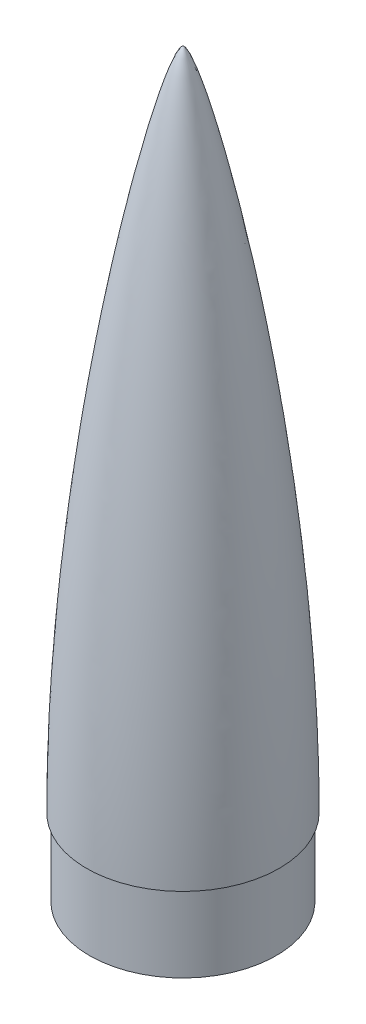
ISO-10303-21;
HEADER;
FILE_DESCRIPTION(('STEP AP214'),'2;1');
FILE_NAME('part.step','',(''),(''),'','','');
FILE_SCHEMA(('AUTOMOTIVE_DESIGN { 1 0 10303 214 1 1 1 1 }'));
ENDSEC;
DATA;
#1=APPLICATION_CONTEXT('core data for automotive mechanical design processes');
#2=APPLICATION_PROTOCOL_DEFINITION('international standard','automotive_design',2000,#1);
#3=PRODUCT_CONTEXT('',#1,'mechanical');
#4=PRODUCT('Part','Part','',(#3));
#5=PRODUCT_RELATED_PRODUCT_CATEGORY('part','',(#4));
#6=PRODUCT_DEFINITION_FORMATION('','',#4);
#7=PRODUCT_DEFINITION_CONTEXT('part definition',#1,'design');
#8=PRODUCT_DEFINITION('design','',#6,#7);
#9=PRODUCT_DEFINITION_SHAPE('','',#8);
#10=(LENGTH_UNIT() NAMED_UNIT(*) SI_UNIT(.MILLI.,.METRE.));
#11=(NAMED_UNIT(*) PLANE_ANGLE_UNIT() SI_UNIT($,.RADIAN.));
#12=(NAMED_UNIT(*) SI_UNIT($,.STERADIAN.) SOLID_ANGLE_UNIT());
#13=UNCERTAINTY_MEASURE_WITH_UNIT(LENGTH_MEASURE(1.E-05),#10,'distance_accuracy_value','');
#14=(GEOMETRIC_REPRESENTATION_CONTEXT(3) GLOBAL_UNCERTAINTY_ASSIGNED_CONTEXT((#13)) GLOBAL_UNIT_ASSIGNED_CONTEXT((#10,
#11,#12)) REPRESENTATION_CONTEXT('',''));
#15=CARTESIAN_POINT('',(0.,0.,0.));
#16=DIRECTION('',(0.,0.,1.));
#17=DIRECTION('',(1.,0.,0.));
#18=AXIS2_PLACEMENT_3D('',#15,#16,#17);
#19=CARTESIAN_POINT('',(0.,0.,0.));
#20=DIRECTION('',(0.,-1.,0.));
#21=DIRECTION('',(0.,0.,-1.));
#22=AXIS2_PLACEMENT_3D('',#19,#20,#21);
#23=PLANE('',#22);
#24=CARTESIAN_POINT('',(0.,0.,0.));
#25=DIRECTION('',(0.,-1.,0.));
#26=DIRECTION('',(0.,0.,-1.));
#27=AXIS2_PLACEMENT_3D('',#24,#25,#26);
#28=CIRCLE('',#27,30.5);
#29=CARTESIAN_POINT('',(0.,0.,-30.5));
#30=VERTEX_POINT('',#29);
#31=EDGE_CURVE('E67',#30,#30,#28,.T.);
#32=ORIENTED_EDGE('',*,*,#31,.F.);
#33=EDGE_LOOP('',(#32));
#34=FACE_BOUND('',#33,.T.);
#35=CARTESIAN_POINT('',(0.,0.,0.));
#36=DIRECTION('',(0.,-1.,0.));
#37=DIRECTION('',(0.,0.,-1.));
#38=AXIS2_PLACEMENT_3D('',#35,#36,#37);
#39=CIRCLE('',#38,31.5);
#40=CARTESIAN_POINT('',(0.,0.,-31.5));
#41=VERTEX_POINT('',#40);
#42=EDGE_CURVE('E62',#41,#41,#39,.T.);
#43=ORIENTED_EDGE('',*,*,#42,.T.);
#44=EDGE_LOOP('',(#43));
#45=FACE_BOUND('',#44,.T.);
#46=ADVANCED_FACE('F39',(#34,#45),#23,.T.);
#47=CARTESIAN_POINT('',(32.5,26.,0.));
#48=CARTESIAN_POINT('',(32.5,136.,0.));
#49=CARTESIAN_POINT('',(5.,250.,0.));
#50=CARTESIAN_POINT('',(0.,250.,0.));
#51=B_SPLINE_CURVE_WITH_KNOTS('',3,(#47,#48,#49,#50),.UNSPECIFIED.,.F.,.F.,(4,4),(0.,1.),.UNSPECIFIED.);
#52=CARTESIAN_POINT('',(0.,0.,0.));
#53=DIRECTION('',(0.,-1.,0.));
#54=AXIS1_PLACEMENT('',#52,#53);
#55=SURFACE_OF_REVOLUTION('',#51,#54);
#56=CARTESIAN_POINT('',(0.,250.,0.));
#57=VERTEX_POINT('',#56);
#58=VERTEX_LOOP('',#57);
#59=FACE_BOUND('',#58,.T.);
#60=CARTESIAN_POINT('',(0.,26.,0.));
#61=DIRECTION('',(0.,-1.,0.));
#62=DIRECTION('',(0.,0.,-1.));
#63=AXIS2_PLACEMENT_3D('',#60,#61,#62);
#64=CIRCLE('',#63,32.5);
#65=CARTESIAN_POINT('',(0.,26.,-32.5));
#66=VERTEX_POINT('',#65);
#67=EDGE_CURVE('E12',#66,#66,#64,.T.);
#68=ORIENTED_EDGE('',*,*,#67,.F.);
#69=EDGE_LOOP('',(#68));
#70=FACE_BOUND('',#69,.T.);
#71=ADVANCED_FACE('F97',(#59,#70),#55,.F.);
#72=CARTESIAN_POINT('',(31.5,26.,0.));
#73=DIRECTION('',(0.,-1.,0.));
#74=DIRECTION('',(0.,0.,-1.));
#75=AXIS2_PLACEMENT_3D('',#72,#73,#74);
#76=PLANE('',#75);
#77=ORIENTED_EDGE('',*,*,#67,.T.);
#78=EDGE_LOOP('',(#77));
#79=FACE_BOUND('',#78,.T.);
#80=CARTESIAN_POINT('',(0.,26.,0.));
#81=DIRECTION('',(0.,-1.,0.));
#82=DIRECTION('',(0.,0.,-1.));
#83=AXIS2_PLACEMENT_3D('',#80,#81,#82);
#84=CIRCLE('',#83,31.5);
#85=CARTESIAN_POINT('',(0.,26.,-31.5));
#86=VERTEX_POINT('',#85);
#87=EDGE_CURVE('E46',#86,#86,#84,.T.);
#88=ORIENTED_EDGE('',*,*,#87,.F.);
#89=EDGE_LOOP('',(#88));
#90=FACE_BOUND('',#89,.T.);
#91=ADVANCED_FACE('F94',(#79,#90),#76,.T.);
#92=CARTESIAN_POINT('',(0.,0.,0.));
#93=DIRECTION('',(0.,-1.,0.));
#94=DIRECTION('',(0.,0.,-1.));
#95=AXIS2_PLACEMENT_3D('',#92,#93,#94);
#96=CYLINDRICAL_SURFACE('',#95,31.5);
#97=ORIENTED_EDGE('',*,*,#87,.T.);
#98=EDGE_LOOP('',(#97));
#99=FACE_BOUND('',#98,.T.);
#100=ORIENTED_EDGE('',*,*,#42,.F.);
#101=EDGE_LOOP('',(#100));
#102=FACE_BOUND('',#101,.T.);
#103=ADVANCED_FACE('F56',(#99,#102),#96,.T.);
#104=CARTESIAN_POINT('',(32.5,26.,0.));
#105=CARTESIAN_POINT('',(32.5,130.947293166395,0.));
#106=CARTESIAN_POINT('',(7.46833103874283,239.535556363517,0.));
#107=CARTESIAN_POINT('',(0.826578255421782,249.289848662872,0.));
#108=B_SPLINE_CURVE_WITH_KNOTS('',3,(#104,#105,#106,#107),.UNSPECIFIED.,.F.,.F.,(4,4),(0.,
0.954066301512677),.UNSPECIFIED.);
#109=CARTESIAN_POINT('',(0.,0.,0.));
#110=DIRECTION('',(0.,-1.,0.));
#111=AXIS1_PLACEMENT('',#109,#110);
#112=SURFACE_OF_REVOLUTION('',#108,#111);
#113=OFFSET_SURFACE('',#112,1.,.F.);
#114=CARTESIAN_POINT('',(0.,248.72702685478,0.));
#115=VERTEX_POINT('',#114);
#116=VERTEX_LOOP('',#115);
#117=FACE_BOUND('',#116,.T.);
#118=CARTESIAN_POINT('',(0.,27.,0.));
#119=DIRECTION('',(0.,-1.,0.));
#120=DIRECTION('',(0.,0.,-1.));
#121=AXIS2_PLACEMENT_3D('',#118,#119,#120);
#122=CIRCLE('',#121,31.4992428345384);
#123=CARTESIAN_POINT('',(0.,27.,-31.4992428345384));
#124=VERTEX_POINT('',#123);
#125=EDGE_CURVE('E60',#124,#124,#122,.T.);
#126=ORIENTED_EDGE('',*,*,#125,.T.);
#127=EDGE_LOOP('',(#126));
#128=FACE_BOUND('',#127,.T.);
#129=ADVANCED_FACE('F52',(#117,#128),#113,.T.);
#130=CARTESIAN_POINT('',(31.5,27.,0.));
#131=DIRECTION('',(0.,-1.,0.));
#132=DIRECTION('',(0.,0.,-1.));
#133=AXIS2_PLACEMENT_3D('',#130,#131,#132);
#134=PLANE('',#133);
#135=ORIENTED_EDGE('',*,*,#125,.F.);
#136=EDGE_LOOP('',(#135));
#137=FACE_BOUND('',#136,.T.);
#138=CARTESIAN_POINT('',(0.,27.,0.));
#139=DIRECTION('',(0.,-1.,0.));
#140=DIRECTION('',(0.,0.,-1.));
#141=AXIS2_PLACEMENT_3D('',#138,#139,#140);
#142=CIRCLE('',#141,30.5);
#143=CARTESIAN_POINT('',(0.,27.,-30.5));
#144=VERTEX_POINT('',#143);
#145=EDGE_CURVE('E63',#144,#144,#142,.T.);
#146=ORIENTED_EDGE('',*,*,#145,.T.);
#147=EDGE_LOOP('',(#146));
#148=FACE_BOUND('',#147,.T.);
#149=ADVANCED_FACE('F55',(#137,#148),#134,.F.);
#150=CARTESIAN_POINT('',(0.,0.,0.));
#151=DIRECTION('',(0.,-1.,0.));
#152=DIRECTION('',(0.,0.,-1.));
#153=AXIS2_PLACEMENT_3D('',#150,#151,#152);
#154=CYLINDRICAL_SURFACE('',#153,30.5);
#155=ORIENTED_EDGE('',*,*,#145,.F.);
#156=EDGE_LOOP('',(#155));
#157=FACE_BOUND('',#156,.T.);
#158=ORIENTED_EDGE('',*,*,#31,.T.);
#159=EDGE_LOOP('',(#158));
#160=FACE_BOUND('',#159,.T.);
#161=ADVANCED_FACE('F88',(#157,#160),#154,.F.);
#162=CLOSED_SHELL('',(#46,#71,#91,#103,#129,#149,#161));
#163=MANIFOLD_SOLID_BREP('B2',#162);
#164=ADVANCED_BREP_SHAPE_REPRESENTATION('',(#18,#163),#14);
#165=SHAPE_DEFINITION_REPRESENTATION(#9,#164);
ENDSEC;
END-ISO-10303-21;
